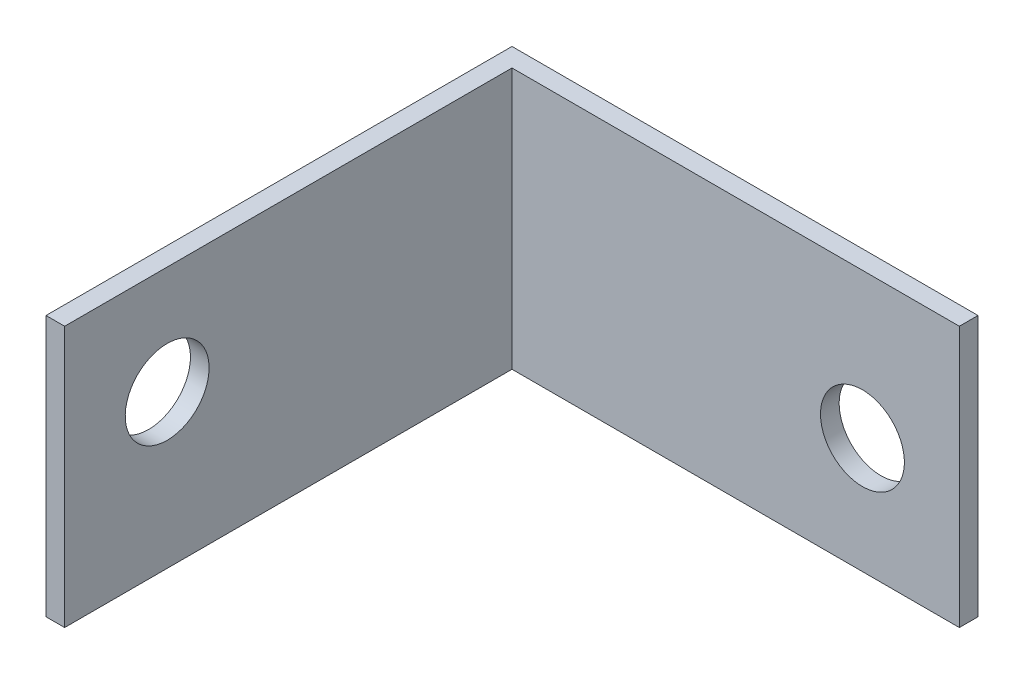
ISO-10303-21;
HEADER;
FILE_DESCRIPTION(('STEP AP214'),'2;1');
FILE_NAME('part.step','',(''),(''),'','','');
FILE_SCHEMA(('AUTOMOTIVE_DESIGN { 1 0 10303 214 1 1 1 1 }'));
ENDSEC;
DATA;
#1=APPLICATION_CONTEXT('core data for automotive mechanical design processes');
#2=APPLICATION_PROTOCOL_DEFINITION('international standard','automotive_design',2000,#1);
#3=PRODUCT_CONTEXT('',#1,'mechanical');
#4=PRODUCT('Part','Part','',(#3));
#5=PRODUCT_RELATED_PRODUCT_CATEGORY('part','',(#4));
#6=PRODUCT_DEFINITION_FORMATION('','',#4);
#7=PRODUCT_DEFINITION_CONTEXT('part definition',#1,'design');
#8=PRODUCT_DEFINITION('design','',#6,#7);
#9=PRODUCT_DEFINITION_SHAPE('','',#8);
#10=(LENGTH_UNIT() NAMED_UNIT(*) SI_UNIT(.MILLI.,.METRE.));
#11=(NAMED_UNIT(*) PLANE_ANGLE_UNIT() SI_UNIT($,.RADIAN.));
#12=(NAMED_UNIT(*) SI_UNIT($,.STERADIAN.) SOLID_ANGLE_UNIT());
#13=UNCERTAINTY_MEASURE_WITH_UNIT(LENGTH_MEASURE(1.E-05),#10,'distance_accuracy_value','');
#14=(GEOMETRIC_REPRESENTATION_CONTEXT(3) GLOBAL_UNCERTAINTY_ASSIGNED_CONTEXT((#13)) GLOBAL_UNIT_ASSIGNED_CONTEXT((#10,
#11,#12)) REPRESENTATION_CONTEXT('',''));
#15=CARTESIAN_POINT('',(0.,0.,0.));
#16=DIRECTION('',(0.,0.,1.));
#17=DIRECTION('',(1.,0.,0.));
#18=AXIS2_PLACEMENT_3D('',#15,#16,#17);
#19=CARTESIAN_POINT('',(10.3564504459156,0.,20.586814797937));
#20=DIRECTION('',(0.,1.,0.));
#21=DIRECTION('',(1.,0.,0.));
#22=AXIS2_PLACEMENT_3D('',#19,#20,#21);
#23=PLANE('',#22);
#24=DIRECTION('',(0.,0.,-1.));
#25=VECTOR('',#24,1.);
#26=CARTESIAN_POINT('',(-2.14354955408442,0.,33.086814797937));
#27=LINE('',#26,#25);
#28=CARTESIAN_POINT('',(-2.14354955408442,0.,33.086814797937));
#29=VERTEX_POINT('',#28);
#30=CARTESIAN_POINT('',(-2.14354955408442,0.,8.08681479793698));
#31=VERTEX_POINT('',#30);
#32=EDGE_CURVE('E26',#29,#31,#27,.T.);
#33=ORIENTED_EDGE('',*,*,#32,.T.);
#34=DIRECTION('',(1.,0.,0.));
#35=VECTOR('',#34,1.);
#36=CARTESIAN_POINT('',(-2.14354955408442,0.,8.08681479793698));
#37=LINE('',#36,#35);
#38=CARTESIAN_POINT('',(22.8564504459156,0.,8.08681479793698));
#39=VERTEX_POINT('',#38);
#40=EDGE_CURVE('E93',#31,#39,#37,.T.);
#41=ORIENTED_EDGE('',*,*,#40,.T.);
#42=DIRECTION('',(0.,0.,1.));
#43=VECTOR('',#42,1.);
#44=CARTESIAN_POINT('',(22.8564504459156,0.,8.08681479793698));
#45=LINE('',#44,#43);
#46=CARTESIAN_POINT('',(22.8564504459156,0.,9.08681479793698));
#47=VERTEX_POINT('',#46);
#48=EDGE_CURVE('E142',#39,#47,#45,.T.);
#49=ORIENTED_EDGE('',*,*,#48,.T.);
#50=DIRECTION('',(-1.,0.,0.));
#51=VECTOR('',#50,1.);
#52=CARTESIAN_POINT('',(22.8564504459156,0.,9.08681479793698));
#53=LINE('',#52,#51);
#54=CARTESIAN_POINT('',(-1.14354955408443,0.,9.08681479793698));
#55=VERTEX_POINT('',#54);
#56=EDGE_CURVE('E164',#47,#55,#53,.T.);
#57=ORIENTED_EDGE('',*,*,#56,.T.);
#58=DIRECTION('',(0.,0.,1.));
#59=VECTOR('',#58,1.);
#60=CARTESIAN_POINT('',(-1.14354955408443,0.,9.08681479793698));
#61=LINE('',#60,#59);
#62=CARTESIAN_POINT('',(-1.14354955408443,0.,33.086814797937));
#63=VERTEX_POINT('',#62);
#64=EDGE_CURVE('E125',#55,#63,#61,.T.);
#65=ORIENTED_EDGE('',*,*,#64,.T.);
#66=DIRECTION('',(1.,0.,0.));
#67=VECTOR('',#66,1.);
#68=CARTESIAN_POINT('',(-2.14354955408442,0.,33.086814797937));
#69=LINE('',#68,#67);
#70=EDGE_CURVE('E119',#29,#63,#69,.T.);
#71=ORIENTED_EDGE('',*,*,#70,.F.);
#72=EDGE_LOOP('',(#33,#41,#49,#57,#65,#71));
#73=FACE_BOUND('',#72,.T.);
#74=ADVANCED_FACE('F15',(#73),#23,.F.);
#75=CARTESIAN_POINT('',(10.3564504459156,14.,20.586814797937));
#76=DIRECTION('',(0.,1.,0.));
#77=DIRECTION('',(1.,0.,0.));
#78=AXIS2_PLACEMENT_3D('',#75,#76,#77);
#79=PLANE('',#78);
#80=DIRECTION('',(0.,0.,1.));
#81=VECTOR('',#80,1.);
#82=CARTESIAN_POINT('',(-2.14354955408442,14.,33.086814797937));
#83=LINE('',#82,#81);
#84=CARTESIAN_POINT('',(-2.14354955408442,14.,8.08681479793698));
#85=VERTEX_POINT('',#84);
#86=CARTESIAN_POINT('',(-2.14354955408442,14.,33.086814797937));
#87=VERTEX_POINT('',#86);
#88=EDGE_CURVE('E10',#85,#87,#83,.T.);
#89=ORIENTED_EDGE('',*,*,#88,.T.);
#90=DIRECTION('',(1.,0.,0.));
#91=VECTOR('',#90,1.);
#92=CARTESIAN_POINT('',(-2.14354955408442,14.,33.086814797937));
#93=LINE('',#92,#91);
#94=CARTESIAN_POINT('',(-1.14354955408443,14.,33.086814797937));
#95=VERTEX_POINT('',#94);
#96=EDGE_CURVE('E153',#87,#95,#93,.T.);
#97=ORIENTED_EDGE('',*,*,#96,.T.);
#98=DIRECTION('',(0.,0.,-1.));
#99=VECTOR('',#98,1.);
#100=CARTESIAN_POINT('',(-1.14354955408443,14.,9.08681479793698));
#101=LINE('',#100,#99);
#102=CARTESIAN_POINT('',(-1.14354955408443,14.,9.08681479793698));
#103=VERTEX_POINT('',#102);
#104=EDGE_CURVE('E120',#95,#103,#101,.T.);
#105=ORIENTED_EDGE('',*,*,#104,.T.);
#106=DIRECTION('',(1.,0.,0.));
#107=VECTOR('',#106,1.);
#108=CARTESIAN_POINT('',(22.8564504459156,14.,9.08681479793698));
#109=LINE('',#108,#107);
#110=CARTESIAN_POINT('',(22.8564504459156,14.,9.08681479793698));
#111=VERTEX_POINT('',#110);
#112=EDGE_CURVE('E126',#103,#111,#109,.T.);
#113=ORIENTED_EDGE('',*,*,#112,.T.);
#114=DIRECTION('',(0.,0.,-1.));
#115=VECTOR('',#114,1.);
#116=CARTESIAN_POINT('',(22.8564504459156,14.,8.08681479793698));
#117=LINE('',#116,#115);
#118=CARTESIAN_POINT('',(22.8564504459156,14.,8.08681479793698));
#119=VERTEX_POINT('',#118);
#120=EDGE_CURVE('E152',#111,#119,#117,.T.);
#121=ORIENTED_EDGE('',*,*,#120,.T.);
#122=DIRECTION('',(-1.,0.,0.));
#123=VECTOR('',#122,1.);
#124=CARTESIAN_POINT('',(-2.14354955408442,14.,8.08681479793698));
#125=LINE('',#124,#123);
#126=EDGE_CURVE('E132',#119,#85,#125,.T.);
#127=ORIENTED_EDGE('',*,*,#126,.T.);
#128=EDGE_LOOP('',(#89,#97,#105,#113,#121,#127));
#129=FACE_BOUND('',#128,.T.);
#130=ADVANCED_FACE('F181',(#129),#79,.T.);
#131=CARTESIAN_POINT('',(-2.14354955408442,0.,8.08681479793698));
#132=DIRECTION('',(-1.,0.,0.));
#133=DIRECTION('',(0.,0.,1.));
#134=AXIS2_PLACEMENT_3D('',#131,#132,#133);
#135=PLANE('',#134);
#136=CARTESIAN_POINT('',(-2.14354955408442,8.2,27.586814797937));
#137=DIRECTION('',(1.,0.,0.));
#138=DIRECTION('',(0.,1.,0.));
#139=AXIS2_PLACEMENT_3D('',#136,#137,#138);
#140=CIRCLE('',#139,2.25);
#141=CARTESIAN_POINT('',(-2.14354955408442,5.95,27.586814797937));
#142=VERTEX_POINT('',#141);
#143=EDGE_CURVE('E110',#142,#142,#140,.T.);
#144=ORIENTED_EDGE('',*,*,#143,.T.);
#145=EDGE_LOOP('',(#144));
#146=FACE_BOUND('',#145,.T.);
#147=ORIENTED_EDGE('',*,*,#32,.F.);
#148=DIRECTION('',(0.,1.,0.));
#149=VECTOR('',#148,1.);
#150=CARTESIAN_POINT('',(-2.14354955408442,0.,33.086814797937));
#151=LINE('',#150,#149);
#152=EDGE_CURVE('E145',#29,#87,#151,.T.);
#153=ORIENTED_EDGE('',*,*,#152,.T.);
#154=ORIENTED_EDGE('',*,*,#88,.F.);
#155=DIRECTION('',(0.,1.,0.));
#156=VECTOR('',#155,1.);
#157=CARTESIAN_POINT('',(-2.14354955408442,0.,8.08681479793698));
#158=LINE('',#157,#156);
#159=EDGE_CURVE('E101',#31,#85,#158,.T.);
#160=ORIENTED_EDGE('',*,*,#159,.F.);
#161=EDGE_LOOP('',(#147,#153,#154,#160));
#162=FACE_BOUND('',#161,.T.);
#163=ADVANCED_FACE('F173',(#146,#162),#135,.T.);
#164=CARTESIAN_POINT('',(-2.14354955408442,0.,33.086814797937));
#165=DIRECTION('',(0.,0.,1.));
#166=DIRECTION('',(1.,0.,0.));
#167=AXIS2_PLACEMENT_3D('',#164,#165,#166);
#168=PLANE('',#167);
#169=ORIENTED_EDGE('',*,*,#70,.T.);
#170=DIRECTION('',(0.,1.,0.));
#171=VECTOR('',#170,1.);
#172=CARTESIAN_POINT('',(-1.14354955408443,0.,33.086814797937));
#173=LINE('',#172,#171);
#174=EDGE_CURVE('E115',#63,#95,#173,.T.);
#175=ORIENTED_EDGE('',*,*,#174,.T.);
#176=ORIENTED_EDGE('',*,*,#96,.F.);
#177=ORIENTED_EDGE('',*,*,#152,.F.);
#178=EDGE_LOOP('',(#169,#175,#176,#177));
#179=FACE_BOUND('',#178,.T.);
#180=ADVANCED_FACE('F177',(#179),#168,.T.);
#181=CARTESIAN_POINT('',(-1.14354955408443,0.,33.086814797937));
#182=DIRECTION('',(1.,0.,0.));
#183=DIRECTION('',(0.,1.,0.));
#184=AXIS2_PLACEMENT_3D('',#181,#182,#183);
#185=PLANE('',#184);
#186=CARTESIAN_POINT('',(-1.14354955408443,8.2,27.586814797937));
#187=DIRECTION('',(-1.,0.,0.));
#188=DIRECTION('',(0.,1.,0.));
#189=AXIS2_PLACEMENT_3D('',#186,#187,#188);
#190=CIRCLE('',#189,2.25);
#191=CARTESIAN_POINT('',(-1.14354955408443,5.95,27.586814797937));
#192=VERTEX_POINT('',#191);
#193=EDGE_CURVE('E127',#192,#192,#190,.T.);
#194=ORIENTED_EDGE('',*,*,#193,.T.);
#195=EDGE_LOOP('',(#194));
#196=FACE_BOUND('',#195,.T.);
#197=ORIENTED_EDGE('',*,*,#64,.F.);
#198=DIRECTION('',(0.,1.,0.));
#199=VECTOR('',#198,1.);
#200=CARTESIAN_POINT('',(-1.14354955408443,0.,9.08681479793698));
#201=LINE('',#200,#199);
#202=EDGE_CURVE('E121',#55,#103,#201,.T.);
#203=ORIENTED_EDGE('',*,*,#202,.T.);
#204=ORIENTED_EDGE('',*,*,#104,.F.);
#205=ORIENTED_EDGE('',*,*,#174,.F.);
#206=EDGE_LOOP('',(#197,#203,#204,#205));
#207=FACE_BOUND('',#206,.T.);
#208=ADVANCED_FACE('F191',(#196,#207),#185,.T.);
#209=CARTESIAN_POINT('',(-1.14354955408443,0.,9.08681479793698));
#210=DIRECTION('',(0.,0.,1.));
#211=DIRECTION('',(1.,0.,0.));
#212=AXIS2_PLACEMENT_3D('',#209,#210,#211);
#213=PLANE('',#212);
#214=CARTESIAN_POINT('',(17.6564504459156,6.2,9.08681479793698));
#215=DIRECTION('',(0.,0.,-1.));
#216=DIRECTION('',(1.,0.,0.));
#217=AXIS2_PLACEMENT_3D('',#214,#215,#216);
#218=CIRCLE('',#217,2.25);
#219=CARTESIAN_POINT('',(15.4064504459156,6.2,9.08681479793698));
#220=VERTEX_POINT('',#219);
#221=EDGE_CURVE('E103',#220,#220,#218,.T.);
#222=ORIENTED_EDGE('',*,*,#221,.T.);
#223=EDGE_LOOP('',(#222));
#224=FACE_BOUND('',#223,.T.);
#225=ORIENTED_EDGE('',*,*,#56,.F.);
#226=DIRECTION('',(0.,1.,0.));
#227=VECTOR('',#226,1.);
#228=CARTESIAN_POINT('',(22.8564504459156,0.,9.08681479793698));
#229=LINE('',#228,#227);
#230=EDGE_CURVE('E114',#47,#111,#229,.T.);
#231=ORIENTED_EDGE('',*,*,#230,.T.);
#232=ORIENTED_EDGE('',*,*,#112,.F.);
#233=ORIENTED_EDGE('',*,*,#202,.F.);
#234=EDGE_LOOP('',(#225,#231,#232,#233));
#235=FACE_BOUND('',#234,.T.);
#236=ADVANCED_FACE('F193',(#224,#235),#213,.T.);
#237=CARTESIAN_POINT('',(22.8564504459156,0.,9.08681479793698));
#238=DIRECTION('',(1.,0.,0.));
#239=DIRECTION('',(0.,1.,0.));
#240=AXIS2_PLACEMENT_3D('',#237,#238,#239);
#241=PLANE('',#240);
#242=ORIENTED_EDGE('',*,*,#48,.F.);
#243=DIRECTION('',(0.,1.,0.));
#244=VECTOR('',#243,1.);
#245=CARTESIAN_POINT('',(22.8564504459156,0.,8.08681479793698));
#246=LINE('',#245,#244);
#247=EDGE_CURVE('E135',#39,#119,#246,.T.);
#248=ORIENTED_EDGE('',*,*,#247,.T.);
#249=ORIENTED_EDGE('',*,*,#120,.F.);
#250=ORIENTED_EDGE('',*,*,#230,.F.);
#251=EDGE_LOOP('',(#242,#248,#249,#250));
#252=FACE_BOUND('',#251,.T.);
#253=ADVANCED_FACE('F207',(#252),#241,.T.);
#254=CARTESIAN_POINT('',(22.8564504459156,0.,8.08681479793698));
#255=DIRECTION('',(0.,0.,-1.));
#256=DIRECTION('',(0.,-1.,0.));
#257=AXIS2_PLACEMENT_3D('',#254,#255,#256);
#258=PLANE('',#257);
#259=CARTESIAN_POINT('',(17.6564504459156,6.2,8.08681479793698));
#260=DIRECTION('',(0.,0.,1.));
#261=DIRECTION('',(1.,0.,0.));
#262=AXIS2_PLACEMENT_3D('',#259,#260,#261);
#263=CIRCLE('',#262,2.25);
#264=CARTESIAN_POINT('',(15.4064504459156,6.2,8.08681479793698));
#265=VERTEX_POINT('',#264);
#266=EDGE_CURVE('E19',#265,#265,#263,.T.);
#267=ORIENTED_EDGE('',*,*,#266,.T.);
#268=EDGE_LOOP('',(#267));
#269=FACE_BOUND('',#268,.T.);
#270=ORIENTED_EDGE('',*,*,#40,.F.);
#271=ORIENTED_EDGE('',*,*,#159,.T.);
#272=ORIENTED_EDGE('',*,*,#126,.F.);
#273=ORIENTED_EDGE('',*,*,#247,.F.);
#274=EDGE_LOOP('',(#270,#271,#272,#273));
#275=FACE_BOUND('',#274,.T.);
#276=ADVANCED_FACE('F88',(#269,#275),#258,.T.);
#277=CARTESIAN_POINT('',(17.6564504459156,6.2,6.83681479793698));
#278=DIRECTION('',(0.,0.,-1.));
#279=DIRECTION('',(1.,0.,0.));
#280=AXIS2_PLACEMENT_3D('',#277,#278,#279);
#281=CYLINDRICAL_SURFACE('',#280,2.25);
#282=ORIENTED_EDGE('',*,*,#221,.F.);
#283=DIRECTION('',(0.,0.,-1.));
#284=VECTOR('',#283,1.);
#285=CARTESIAN_POINT('',(15.4064504459156,6.2,6.83681479793698));
#286=LINE('',#285,#284);
#287=EDGE_CURVE('E94',#220,#265,#286,.T.);
#288=ORIENTED_EDGE('',*,*,#287,.T.);
#289=ORIENTED_EDGE('',*,*,#266,.F.);
#290=ORIENTED_EDGE('',*,*,#287,.F.);
#291=EDGE_LOOP('',(#282,#288,#289,#290));
#292=FACE_BOUND('',#291,.T.);
#293=ADVANCED_FACE('F17',(#292),#281,.F.);
#294=CARTESIAN_POINT('',(-3.39354955408443,8.2,27.586814797937));
#295=DIRECTION('',(-1.,0.,0.));
#296=DIRECTION('',(0.,1.,0.));
#297=AXIS2_PLACEMENT_3D('',#294,#295,#296);
#298=CYLINDRICAL_SURFACE('',#297,2.25);
#299=ORIENTED_EDGE('',*,*,#193,.F.);
#300=DIRECTION('',(-1.,0.,0.));
#301=VECTOR('',#300,1.);
#302=CARTESIAN_POINT('',(-3.39354955408443,5.95,27.586814797937));
#303=LINE('',#302,#301);
#304=EDGE_CURVE('E131',#192,#142,#303,.T.);
#305=ORIENTED_EDGE('',*,*,#304,.T.);
#306=ORIENTED_EDGE('',*,*,#143,.F.);
#307=ORIENTED_EDGE('',*,*,#304,.F.);
#308=EDGE_LOOP('',(#299,#305,#306,#307));
#309=FACE_BOUND('',#308,.T.);
#310=ADVANCED_FACE('F300',(#309),#298,.F.);
#311=CLOSED_SHELL('',(#74,#130,#163,#180,#208,#236,#253,#276,#293,#310));
#312=MANIFOLD_SOLID_BREP('B1',#311);
#313=ADVANCED_BREP_SHAPE_REPRESENTATION('',(#18,#312),#14);
#314=SHAPE_DEFINITION_REPRESENTATION(#9,#313);
ENDSEC;
END-ISO-10303-21;
